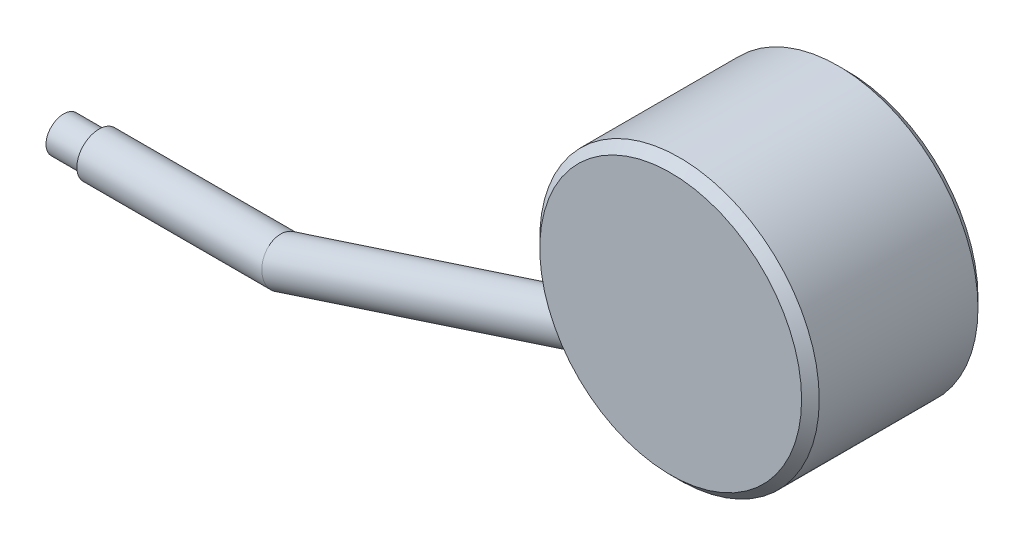
ISO-10303-21;
HEADER;
FILE_DESCRIPTION(('STEP AP214'),'2;1');
FILE_NAME('part.step','',(''),(''),'','','');
FILE_SCHEMA(('AUTOMOTIVE_DESIGN { 1 0 10303 214 1 1 1 1 }'));
ENDSEC;
DATA;
#1=APPLICATION_CONTEXT('core data for automotive mechanical design processes');
#2=APPLICATION_PROTOCOL_DEFINITION('international standard','automotive_design',2000,#1);
#3=PRODUCT_CONTEXT('',#1,'mechanical');
#4=PRODUCT('Part','Part','',(#3));
#5=PRODUCT_RELATED_PRODUCT_CATEGORY('part','',(#4));
#6=PRODUCT_DEFINITION_FORMATION('','',#4);
#7=PRODUCT_DEFINITION_CONTEXT('part definition',#1,'design');
#8=PRODUCT_DEFINITION('design','',#6,#7);
#9=PRODUCT_DEFINITION_SHAPE('','',#8);
#10=(LENGTH_UNIT() NAMED_UNIT(*) SI_UNIT(.MILLI.,.METRE.));
#11=(NAMED_UNIT(*) PLANE_ANGLE_UNIT() SI_UNIT($,.RADIAN.));
#12=(NAMED_UNIT(*) SI_UNIT($,.STERADIAN.) SOLID_ANGLE_UNIT());
#13=UNCERTAINTY_MEASURE_WITH_UNIT(LENGTH_MEASURE(1.E-05),#10,'distance_accuracy_value','');
#14=(GEOMETRIC_REPRESENTATION_CONTEXT(3) GLOBAL_UNCERTAINTY_ASSIGNED_CONTEXT((#13)) GLOBAL_UNIT_ASSIGNED_CONTEXT((#10,
#11,#12)) REPRESENTATION_CONTEXT('',''));
#15=CARTESIAN_POINT('',(0.,0.,0.));
#16=DIRECTION('',(0.,0.,1.));
#17=DIRECTION('',(1.,0.,0.));
#18=AXIS2_PLACEMENT_3D('',#15,#16,#17);
#19=CARTESIAN_POINT('',(0.,0.,0.));
#20=DIRECTION('',(1.,0.,0.));
#21=DIRECTION('',(0.,0.,-1.));
#22=AXIS2_PLACEMENT_3D('',#19,#20,#21);
#23=CYLINDRICAL_SURFACE('',#22,5.);
#24=CARTESIAN_POINT('',(50.,0.,0.));
#25=DIRECTION('',(0.987560360358559,0.157240372196433,0.));
#26=DIRECTION('',(0.157240372196433,-0.987560360358559,0.));
#27=AXIS2_PLACEMENT_3D('',#24,#25,#26);
#28=ELLIPSE('',#27,5.06298166745435,5.);
#29=CARTESIAN_POINT('',(50.7961051218142,-5.,0.));
#30=VERTEX_POINT('',#29);
#31=EDGE_CURVE('E44',#30,#30,#28,.F.);
#32=ORIENTED_EDGE('',*,*,#31,.T.);
#33=EDGE_LOOP('',(#32));
#34=FACE_BOUND('',#33,.T.);
#35=CARTESIAN_POINT('',(8.,0.,0.));
#36=DIRECTION('',(-1.,0.,0.));
#37=DIRECTION('',(0.,0.,1.));
#38=AXIS2_PLACEMENT_3D('',#35,#36,#37);
#39=CIRCLE('',#38,5.);
#40=CARTESIAN_POINT('',(8.,0.,5.));
#41=VERTEX_POINT('',#40);
#42=EDGE_CURVE('E48',#41,#41,#39,.F.);
#43=ORIENTED_EDGE('',*,*,#42,.T.);
#44=EDGE_LOOP('',(#43));
#45=FACE_BOUND('',#44,.T.);
#46=ADVANCED_FACE('F33',(#34,#45),#23,.T.);
#47=CARTESIAN_POINT('',(48.2401202850781,-0.574996633992243,0.));
#48=DIRECTION('',(0.950550930703055,0.310568717258446,0.));
#49=DIRECTION('',(-0.310568717258446,0.950550930703055,0.));
#50=AXIS2_PLACEMENT_3D('',#47,#48,#49);
#51=CYLINDRICAL_SURFACE('',#50,5.);
#52=CARTESIAN_POINT('',(132.556723260454,32.2334497336171,0.));
#53=CARTESIAN_POINT('',(132.556723264825,32.2334497207044,0.133753967924831));
#54=CARTESIAN_POINT('',(132.560200299583,32.2289349502857,0.267508272690018));
#55=CARTESIAN_POINT('',(132.57409600248,32.2109221666827,0.534098141413521));
#56=CARTESIAN_POINT('',(132.584517286134,32.197420768736,0.666933340141334));
#57=CARTESIAN_POINT('',(132.612253652751,32.1615861704517,0.930630551171096));
#58=CARTESIAN_POINT('',(132.62956634759,32.1392560296141,1.06149323073561));
#59=CARTESIAN_POINT('',(132.671016328416,32.0859983620567,1.32040821734099));
#60=CARTESIAN_POINT('',(132.695156172465,32.0550676128535,1.44845945154588));
#61=CARTESIAN_POINT('',(132.75011657676,31.9849887500913,1.7006596170187));
#62=CARTESIAN_POINT('',(132.780929524066,31.9458500021392,1.82481281202875));
#63=CARTESIAN_POINT('',(132.849120727331,31.8597390428389,2.06856665796621));
#64=CARTESIAN_POINT('',(132.886501395392,31.8127639537908,2.18816561657416));
#65=CARTESIAN_POINT('',(132.967625323871,31.7115079594991,2.42192860881017));
#66=CARTESIAN_POINT('',(133.01136609016,31.6572299187486,2.53609474974594));
#67=CARTESIAN_POINT('',(133.10502121858,31.5418987963668,2.75836382699639));
#68=CARTESIAN_POINT('',(133.154937888556,31.4808431829366,2.8664644746583));
#69=CARTESIAN_POINT('',(133.261491844648,31.3516095941642,3.0775168825378));
#70=CARTESIAN_POINT('',(133.318219867343,31.2833373478473,3.18036521600706));
#71=CARTESIAN_POINT('',(133.437470998255,31.1411505201411,3.37854719515039));
#72=CARTESIAN_POINT('',(133.499996195198,31.0672339067877,3.47387810922033));
#73=CARTESIAN_POINT('',(133.695752128263,30.8381284560876,3.74776336873493));
#74=CARTESIAN_POINT('',(133.837255691783,30.6754707255072,3.9143931545285));
#75=CARTESIAN_POINT('',(134.146844884592,30.327686386998,4.22036651192981));
#76=CARTESIAN_POINT('',(134.31592420896,30.1418340306097,4.35786281999765));
#77=CARTESIAN_POINT('',(134.671084955313,29.761380335061,4.59297623008079));
#78=CARTESIAN_POINT('',(134.857172129238,29.5667760474427,4.69057977911422));
#79=CARTESIAN_POINT('',(135.259104589223,29.1575607193442,4.85270470888985));
#80=CARTESIAN_POINT('',(135.47613035311,28.9426819671977,4.91360948337197));
#81=CARTESIAN_POINT('',(135.920478001705,28.5155881564811,4.98979274113684));
#82=CARTESIAN_POINT('',(136.147803856094,28.3033741658569,5.00505347862076));
#83=CARTESIAN_POINT('',(136.63390224208,27.8628566142775,4.99130019873017));
#84=CARTESIAN_POINT('',(136.893330157032,27.6354372754505,4.95709939223928));
#85=CARTESIAN_POINT('',(137.412646497819,27.1947021996294,4.83775624616358));
#86=CARTESIAN_POINT('',(137.672535127543,26.9813985395847,4.75257089585965));
#87=CARTESIAN_POINT('',(138.210914773554,26.5531121311033,4.52312321478195));
#88=CARTESIAN_POINT('',(138.48877942751,26.3399553702174,4.37395140655081));
#89=CARTESIAN_POINT('',(139.027169876487,25.939932523246,4.01936020889727));
#90=CARTESIAN_POINT('',(139.287703475677,25.7530545610111,3.81396635231035));
#91=CARTESIAN_POINT('',(139.726457220185,25.4471288317526,3.3978569773046));
#92=CARTESIAN_POINT('',(139.91040018043,25.322107519986,3.19756039344302));
#93=CARTESIAN_POINT('',(140.25136414508,25.0948313923796,2.76392742826314));
#94=CARTESIAN_POINT('',(140.408426305318,24.9925417003184,2.53064257216782));
#95=CARTESIAN_POINT('',(140.658622063327,24.8320362316854,2.08168104343836));
#96=CARTESIAN_POINT('',(140.758246228902,24.7691204486589,1.87135904183863));
#97=CARTESIAN_POINT('',(140.88502085126,24.68975986894,1.54362444188306));
#98=CARTESIAN_POINT('',(140.923508029102,24.6658049465004,1.43231208235826));
#99=CARTESIAN_POINT('',(140.99222906113,24.6231935149735,1.20620065347568));
#100=CARTESIAN_POINT('',(141.022466496366,24.6045347068049,1.0914031210879));
#101=CARTESIAN_POINT('',(141.074235406828,24.5726745596695,0.858271768277501));
#102=CARTESIAN_POINT('',(141.095705840291,24.5595114718167,0.739919113642221));
#103=CARTESIAN_POINT('',(141.129142762945,24.5390427233506,0.501369231376612));
#104=CARTESIAN_POINT('',(141.141109256304,24.5317370601698,0.381172004554876));
#105=CARTESIAN_POINT('',(141.155237780852,24.5231138088878,0.140023783956342));
#106=CARTESIAN_POINT('',(141.157402852583,24.5217943637762,0.019073035593358));
#107=CARTESIAN_POINT('',(141.151881828755,24.52516225465,-0.22251147135971));
#108=CARTESIAN_POINT('',(141.144196481654,24.5298491342608,-0.34314525333579));
#109=CARTESIAN_POINT('',(141.120490617011,24.5443377818458,-0.570360765221269));
#110=CARTESIAN_POINT('',(141.105434853034,24.5535478529193,-0.677082470495329));
#111=CARTESIAN_POINT('',(141.067896853902,24.5765765548024,-0.888719587672213));
#112=CARTESIAN_POINT('',(141.045412172881,24.5903967034299,-0.993634392693308));
#113=CARTESIAN_POINT('',(140.967401083993,24.6385203892804,-1.30461837331899));
#114=CARTESIAN_POINT('',(140.901297524222,24.6794992297317,-1.50711059111253));
#115=CARTESIAN_POINT('',(140.741050849573,24.7799804586049,-1.90829587171869));
#116=CARTESIAN_POINT('',(140.64564176731,24.8403262734028,-2.1062594030032));
#117=CARTESIAN_POINT('',(140.433359781154,24.9765860114405,-2.48451818565527));
#118=CARTESIAN_POINT('',(140.316470587241,25.0525117552701,-2.66479986728807));
#119=CARTESIAN_POINT('',(140.007572147901,25.2565700637493,-3.08582627702458));
#120=CARTESIAN_POINT('',(139.805903310325,25.3925634733913,-3.31571492003471));
#121=CARTESIAN_POINT('',(139.378330689665,25.6892358563362,-3.73318566050877));
#122=CARTESIAN_POINT('',(139.152390038663,25.8499525479375,-3.92070201628121));
#123=CARTESIAN_POINT('',(138.682536879815,26.19447635831,-4.25444040650524));
#124=CARTESIAN_POINT('',(138.438440597117,26.378538412669,-4.40013753928476));
#125=CARTESIAN_POINT('',(137.941955894792,26.765085310751,-4.64591061666037));
#126=CARTESIAN_POINT('',(137.689568385491,26.9675681362782,-4.74599155180348));
#127=CARTESIAN_POINT('',(137.292639545918,27.296522195698,-4.86546756329618));
#128=CARTESIAN_POINT('',(137.148644483971,27.4180115398827,-4.90103962036203));
#129=CARTESIAN_POINT('',(136.861137991394,27.665066178417,-4.95636569103827));
#130=CARTESIAN_POINT('',(136.717626411094,27.7906300525625,-4.97612515589704));
#131=CARTESIAN_POINT('',(136.432060259522,28.0451067836042,-4.99933321660571));
#132=CARTESIAN_POINT('',(136.29000690175,28.1740221570133,-5.00276917796071));
#133=CARTESIAN_POINT('',(136.008647364999,28.4340593646457,-4.99278091086847));
#134=CARTESIAN_POINT('',(135.869339778229,28.5651800007298,-4.97936556341129));
#135=CARTESIAN_POINT('',(135.598935763668,28.8243146560411,-4.93591278428232));
#136=CARTESIAN_POINT('',(135.46771918479,28.9522941606288,-4.90641986649107));
#137=CARTESIAN_POINT('',(135.209994199361,29.2079917280719,-4.83085713626916));
#138=CARTESIAN_POINT('',(135.08348340444,29.3357098915828,-4.78479586317722));
#139=CARTESIAN_POINT('',(134.836247428923,29.5894807219676,-4.67589756395894));
#140=CARTESIAN_POINT('',(134.71551954737,29.7155341460472,-4.61306846129384));
#141=CARTESIAN_POINT('',(134.480889506643,29.9644518960476,-4.47059428401773));
#142=CARTESIAN_POINT('',(134.366986304268,30.0873167077344,-4.39095178791388));
#143=CARTESIAN_POINT('',(134.159909946904,30.3140887856044,-4.22533580889214));
#144=CARTESIAN_POINT('',(134.065868376551,30.4185358690492,-4.14118385972679));
#145=CARTESIAN_POINT('',(133.8846648438,30.6223480010674,-3.96027202884175));
#146=CARTESIAN_POINT('',(133.797501911461,30.7217137654468,-3.8635139298028));
#147=CARTESIAN_POINT('',(133.630766075267,30.9140379183952,-3.65796915889391));
#148=CARTESIAN_POINT('',(133.551189242159,31.0069996169793,-3.5491887777584));
#149=CARTESIAN_POINT('',(133.400196563202,31.185289133529,-3.32029706593559));
#150=CARTESIAN_POINT('',(133.328779892586,31.2706177228006,-3.20018688262124));
#151=CARTESIAN_POINT('',(133.201988698565,31.4235623456208,-2.96328545586612));
#152=CARTESIAN_POINT('',(133.145713964208,31.4920950215531,-2.84756543729768));
#153=CARTESIAN_POINT('',(133.040411486157,31.6213079287812,-2.60868824102964));
#154=CARTESIAN_POINT('',(132.991383034387,31.6819889272391,-2.48553179164695));
#155=CARTESIAN_POINT('',(132.900875926765,31.7947344447338,-2.23273648672805));
#156=CARTESIAN_POINT('',(132.85939434305,31.846802304585,-2.1031001700917));
#157=CARTESIAN_POINT('',(132.784194810548,31.9416960235419,-1.83831073068072));
#158=CARTESIAN_POINT('',(132.75047644793,31.9845223752727,-1.70315790242461));
#159=CARTESIAN_POINT('',(132.693560261446,32.0571098674601,-1.44030849636504));
#160=CARTESIAN_POINT('',(132.669705194085,32.0876801152083,-1.312976524905));
#161=CARTESIAN_POINT('',(132.628728406598,32.1403357103307,-1.05546018307769));
#162=CARTESIAN_POINT('',(132.611608709105,32.1624185088754,-0.925274968252104));
#163=CARTESIAN_POINT('',(132.584195980193,32.1978368332953,-0.663074782851945));
#164=CARTESIAN_POINT('',(132.573899641896,32.2111765963665,-0.531060730323457));
#165=CARTESIAN_POINT('',(132.560162014731,32.2289846902017,-0.266031463817782));
#166=CARTESIAN_POINT('',(132.556723256108,32.2334497464585,-0.133015898475475));
#167=CARTESIAN_POINT('',(132.556723260454,32.2334497336171,0.));
#168=B_SPLINE_CURVE_WITH_KNOTS('',3,(#52,#53,#54,#55,#56,#57,#58,#59,#60,#61,#62,#63,#64,#65,
#66,#67,#68,#69,#70,#71,#72,#73,#74,#75,#76,#77,#78,#79,#80,#81,#82,#83,#84,#85,#86,#87,#88,#89,
#90,#91,#92,#93,#94,#95,#96,#97,#98,#99,#100,#101,#102,#103,#104,#105,#106,#107,#108,#109,#110,
#111,#112,#113,#114,#115,#116,#117,#118,#119,#120,#121,#122,#123,#124,#125,#126,#127,#128,#129,
#130,#131,#132,#133,#134,#135,#136,#137,#138,#139,#140,#141,#142,#143,#144,#145,#146,#147,#148,
#149,#150,#151,#152,#153,#154,#155,#156,#157,#158,#159,#160,#161,#162,#163,#164,#165,#166,#167),
.UNSPECIFIED.,.T.,.F.,(4,2,2,2,2,2,2,2,2,2,2,2,2,2,2,2,2,2,2,2,2,2,2,2,2,2,2,2,2,2,2,2,2,2,2,2,
2,2,2,2,2,2,2,2,2,2,2,2,2,2,2,2,2,2,2,2,2,4),(0.,0.401141507355615,0.802434187952615,
1.20358792687718,1.60489217344181,2.00574098556505,2.40673732471632,2.80757683402607,
3.20856658621087,3.61566032128004,4.02290130677774,4.83668886457133,5.69238794002051,
6.54837748556471,7.47883292995825,8.40965007614913,9.44543260630786,10.4820901598612,
11.6188293282759,12.7550531088957,13.6496666468192,14.5428979902692,15.2629558306354,
15.6231415638272,15.9831706978274,16.3456655229646,16.7081601892019,17.0705423967094,
17.4328970711966,17.7570286682828,18.0812670876743,18.7291956189397,19.4104086839376,
20.0921405133098,21.0908140071057,22.0910264890878,23.1032932181521,24.115449175643,
24.6900394435065,25.2644315411274,25.8392681495099,26.413801934117,26.9699877832343,
27.5258873836593,28.0815247632726,28.637076991989,29.1278394204885,29.6185325236936,
30.1089700735358,30.5993580098122,31.0361660063804,31.472931291564,31.9095267674937,
32.3460989646384,32.7449536327802,33.143927985846,33.5427088380374,33.9416368014059),.UNSPECIFIED.);
#169=CARTESIAN_POINT('',(132.556723260454,32.2334497336171,0.));
#170=VERTEX_POINT('',#169);
#171=EDGE_CURVE('E47',#170,#170,#168,.T.);
#172=ORIENTED_EDGE('',*,*,#171,.F.);
#173=EDGE_LOOP('',(#172));
#174=FACE_BOUND('',#173,.T.);
#175=ORIENTED_EDGE('',*,*,#31,.F.);
#176=EDGE_LOOP('',(#175));
#177=FACE_BOUND('',#176,.T.);
#178=ADVANCED_FACE('F45',(#174,#177),#51,.T.);
#179=CARTESIAN_POINT('',(157.656014810832,51.574343956958,-20.));
#180=DIRECTION('',(0.,0.,1.));
#181=DIRECTION('',(1.,0.,0.));
#182=AXIS2_PLACEMENT_3D('',#179,#180,#181);
#183=CYLINDRICAL_SURFACE('',#182,31.6866632148183);
#184=CARTESIAN_POINT('',(157.656014810832,51.574343956958,18.));
#185=DIRECTION('',(0.,0.,1.));
#186=DIRECTION('',(1.,0.,0.));
#187=AXIS2_PLACEMENT_3D('',#184,#185,#186);
#188=CIRCLE('',#187,31.6866632148183);
#189=CARTESIAN_POINT('',(189.34267802565,51.574343956958,18.));
#190=VERTEX_POINT('',#189);
#191=EDGE_CURVE('E40',#190,#190,#188,.F.);
#192=ORIENTED_EDGE('',*,*,#191,.T.);
#193=EDGE_LOOP('',(#192));
#194=FACE_BOUND('',#193,.T.);
#195=CARTESIAN_POINT('',(157.656014810832,51.574343956958,-18.));
#196=DIRECTION('',(0.,0.,1.));
#197=DIRECTION('',(1.,0.,0.));
#198=AXIS2_PLACEMENT_3D('',#195,#196,#197);
#199=CIRCLE('',#198,31.6866632148183);
#200=CARTESIAN_POINT('',(189.34267802565,51.574343956958,-18.));
#201=VERTEX_POINT('',#200);
#202=EDGE_CURVE('E111',#201,#201,#199,.T.);
#203=ORIENTED_EDGE('',*,*,#202,.T.);
#204=EDGE_LOOP('',(#203));
#205=FACE_BOUND('',#204,.T.);
#206=ORIENTED_EDGE('',*,*,#171,.T.);
#207=EDGE_LOOP('',(#206));
#208=FACE_BOUND('',#207,.T.);
#209=ADVANCED_FACE('F67',(#194,#205,#208),#183,.T.);
#210=CARTESIAN_POINT('',(157.656014810832,51.574343956958,-20.));
#211=DIRECTION('',(0.,0.,1.));
#212=DIRECTION('',(1.,0.,0.));
#213=AXIS2_PLACEMENT_3D('',#210,#211,#212);
#214=PLANE('',#213);
#215=CARTESIAN_POINT('',(157.656014810832,51.574343956958,-20.));
#216=DIRECTION('',(0.,0.,1.));
#217=DIRECTION('',(1.,0.,0.));
#218=AXIS2_PLACEMENT_3D('',#215,#216,#217);
#219=CIRCLE('',#218,29.6866632148183);
#220=CARTESIAN_POINT('',(187.34267802565,51.574343956958,-20.));
#221=VERTEX_POINT('',#220);
#222=EDGE_CURVE('E11',#221,#221,#219,.F.);
#223=ORIENTED_EDGE('',*,*,#222,.T.);
#224=EDGE_LOOP('',(#223));
#225=FACE_BOUND('',#224,.T.);
#226=ADVANCED_FACE('F71',(#225),#214,.F.);
#227=CARTESIAN_POINT('',(157.656014810832,51.574343956958,20.));
#228=DIRECTION('',(0.,0.,1.));
#229=DIRECTION('',(1.,0.,0.));
#230=AXIS2_PLACEMENT_3D('',#227,#228,#229);
#231=PLANE('',#230);
#232=CARTESIAN_POINT('',(157.656014810832,51.574343956958,20.));
#233=DIRECTION('',(0.,0.,1.));
#234=DIRECTION('',(1.,0.,0.));
#235=AXIS2_PLACEMENT_3D('',#232,#233,#234);
#236=CIRCLE('',#235,29.6866632148184);
#237=CARTESIAN_POINT('',(187.34267802565,51.574343956958,20.));
#238=VERTEX_POINT('',#237);
#239=EDGE_CURVE('E51',#238,#238,#236,.T.);
#240=ORIENTED_EDGE('',*,*,#239,.T.);
#241=EDGE_LOOP('',(#240));
#242=FACE_BOUND('',#241,.T.);
#243=ADVANCED_FACE('F86',(#242),#231,.T.);
#244=CARTESIAN_POINT('',(8.,0.,0.));
#245=DIRECTION('',(-1.,0.,0.));
#246=DIRECTION('',(0.,0.,1.));
#247=AXIS2_PLACEMENT_3D('',#244,#245,#246);
#248=PLANE('',#247);
#249=ORIENTED_EDGE('',*,*,#42,.F.);
#250=EDGE_LOOP('',(#249));
#251=FACE_BOUND('',#250,.T.);
#252=CARTESIAN_POINT('',(8.,0.,0.));
#253=DIRECTION('',(-1.,0.,0.));
#254=DIRECTION('',(0.,0.,1.));
#255=AXIS2_PLACEMENT_3D('',#252,#253,#254);
#256=CIRCLE('',#255,4.);
#257=CARTESIAN_POINT('',(8.,0.,4.));
#258=VERTEX_POINT('',#257);
#259=EDGE_CURVE('E54',#258,#258,#256,.T.);
#260=ORIENTED_EDGE('',*,*,#259,.F.);
#261=EDGE_LOOP('',(#260));
#262=FACE_BOUND('',#261,.T.);
#263=ADVANCED_FACE('F82',(#251,#262),#248,.T.);
#264=CARTESIAN_POINT('',(8.,0.,0.));
#265=DIRECTION('',(-1.,0.,0.));
#266=DIRECTION('',(0.,0.,1.));
#267=AXIS2_PLACEMENT_3D('',#264,#265,#266);
#268=CYLINDRICAL_SURFACE('',#267,4.);
#269=ORIENTED_EDGE('',*,*,#259,.T.);
#270=EDGE_LOOP('',(#269));
#271=FACE_BOUND('',#270,.T.);
#272=CARTESIAN_POINT('',(0.,0.,0.));
#273=DIRECTION('',(-1.,0.,0.));
#274=DIRECTION('',(0.,0.,1.));
#275=AXIS2_PLACEMENT_3D('',#272,#273,#274);
#276=CIRCLE('',#275,4.);
#277=CARTESIAN_POINT('',(0.,0.,4.));
#278=VERTEX_POINT('',#277);
#279=EDGE_CURVE('E57',#278,#278,#276,.T.);
#280=ORIENTED_EDGE('',*,*,#279,.F.);
#281=EDGE_LOOP('',(#280));
#282=FACE_BOUND('',#281,.T.);
#283=ADVANCED_FACE('F85',(#271,#282),#268,.T.);
#284=CARTESIAN_POINT('',(0.,0.,0.));
#285=DIRECTION('',(1.,0.,0.));
#286=DIRECTION('',(0.,0.,-1.));
#287=AXIS2_PLACEMENT_3D('',#284,#285,#286);
#288=PLANE('',#287);
#289=ORIENTED_EDGE('',*,*,#279,.T.);
#290=EDGE_LOOP('',(#289));
#291=FACE_BOUND('',#290,.T.);
#292=ADVANCED_FACE('F94',(#291),#288,.F.);
#293=CARTESIAN_POINT('',(157.656014810832,51.574343956958,20.));
#294=DIRECTION('',(0.,0.,-1.));
#295=DIRECTION('',(-1.,0.,0.));
#296=AXIS2_PLACEMENT_3D('',#293,#294,#295);
#297=CONICAL_SURFACE('',#296,29.6866632148184,0.785398163397448);
#298=ORIENTED_EDGE('',*,*,#191,.F.);
#299=EDGE_LOOP('',(#298));
#300=FACE_BOUND('',#299,.T.);
#301=ORIENTED_EDGE('',*,*,#239,.F.);
#302=EDGE_LOOP('',(#301));
#303=FACE_BOUND('',#302,.T.);
#304=ADVANCED_FACE('F101',(#300,#303),#297,.T.);
#305=CARTESIAN_POINT('',(157.656014810832,51.574343956958,-18.));
#306=DIRECTION('',(0.,0.,1.));
#307=DIRECTION('',(1.,0.,0.));
#308=AXIS2_PLACEMENT_3D('',#305,#306,#307);
#309=CONICAL_SURFACE('',#308,31.6866632148183,0.785398163397448);
#310=ORIENTED_EDGE('',*,*,#222,.F.);
#311=EDGE_LOOP('',(#310));
#312=FACE_BOUND('',#311,.T.);
#313=ORIENTED_EDGE('',*,*,#202,.F.);
#314=EDGE_LOOP('',(#313));
#315=FACE_BOUND('',#314,.T.);
#316=ADVANCED_FACE('F35',(#312,#315),#309,.T.);
#317=CLOSED_SHELL('',(#46,#178,#209,#226,#243,#263,#283,#292,#304,#316));
#318=MANIFOLD_SOLID_BREP('B2',#317);
#319=ADVANCED_BREP_SHAPE_REPRESENTATION('',(#18,#318),#14);
#320=SHAPE_DEFINITION_REPRESENTATION(#9,#319);
ENDSEC;
END-ISO-10303-21;
